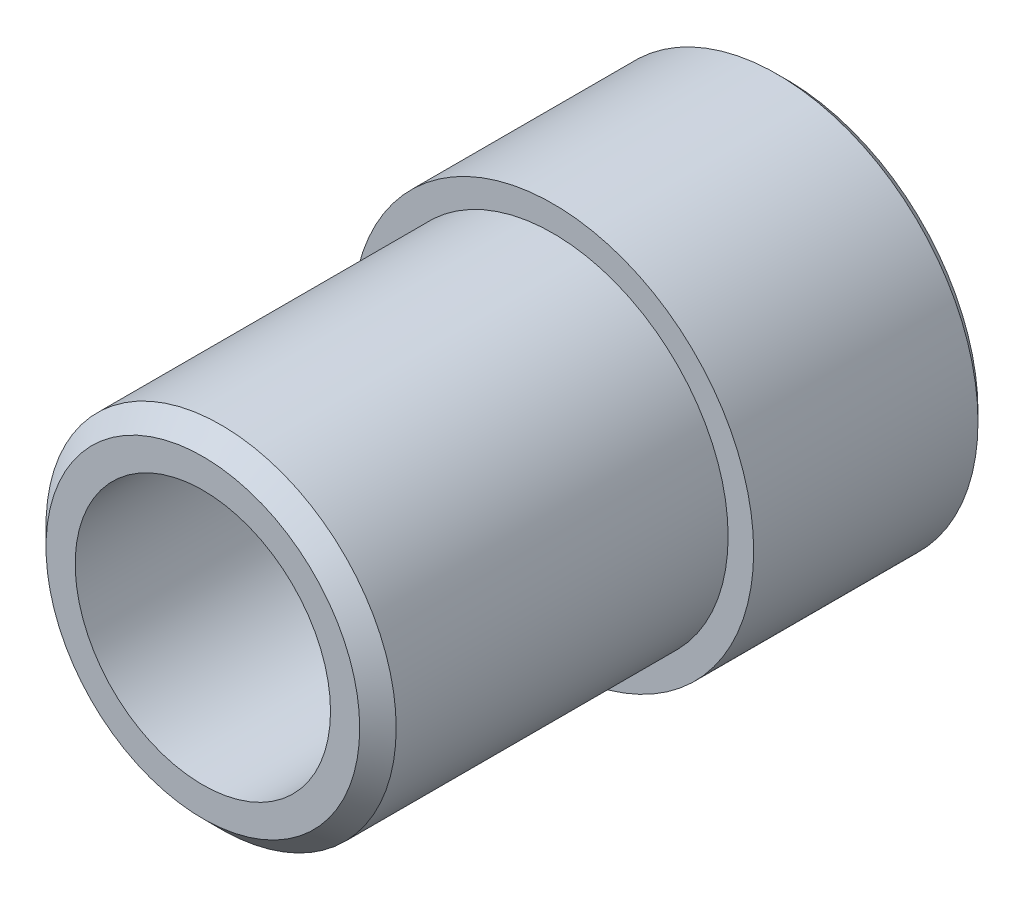
ISO-10303-21;
HEADER;
FILE_DESCRIPTION(('STEP AP214'),'2;1');
FILE_NAME('part.step','',(''),(''),'','','');
FILE_SCHEMA(('AUTOMOTIVE_DESIGN { 1 0 10303 214 1 1 1 1 }'));
ENDSEC;
DATA;
#1=APPLICATION_CONTEXT('core data for automotive mechanical design processes');
#2=APPLICATION_PROTOCOL_DEFINITION('international standard','automotive_design',2000,#1);
#3=PRODUCT_CONTEXT('',#1,'mechanical');
#4=PRODUCT('Part','Part','',(#3));
#5=PRODUCT_RELATED_PRODUCT_CATEGORY('part','',(#4));
#6=PRODUCT_DEFINITION_FORMATION('','',#4);
#7=PRODUCT_DEFINITION_CONTEXT('part definition',#1,'design');
#8=PRODUCT_DEFINITION('design','',#6,#7);
#9=PRODUCT_DEFINITION_SHAPE('','',#8);
#10=(LENGTH_UNIT() NAMED_UNIT(*) SI_UNIT(.MILLI.,.METRE.));
#11=(NAMED_UNIT(*) PLANE_ANGLE_UNIT() SI_UNIT($,.RADIAN.));
#12=(NAMED_UNIT(*) SI_UNIT($,.STERADIAN.) SOLID_ANGLE_UNIT());
#13=UNCERTAINTY_MEASURE_WITH_UNIT(LENGTH_MEASURE(1.E-05),#10,'distance_accuracy_value','');
#14=(GEOMETRIC_REPRESENTATION_CONTEXT(3) GLOBAL_UNCERTAINTY_ASSIGNED_CONTEXT((#13)) GLOBAL_UNIT_ASSIGNED_CONTEXT((#10,
#11,#12)) REPRESENTATION_CONTEXT('',''));
#15=CARTESIAN_POINT('',(0.,0.,0.));
#16=DIRECTION('',(0.,0.,1.));
#17=DIRECTION('',(1.,0.,0.));
#18=AXIS2_PLACEMENT_3D('',#15,#16,#17);
#19=CARTESIAN_POINT('',(0.,0.,0.));
#20=DIRECTION('',(0.,0.,1.));
#21=DIRECTION('',(1.,0.,0.));
#22=AXIS2_PLACEMENT_3D('',#19,#20,#21);
#23=PLANE('',#22);
#24=CARTESIAN_POINT('',(0.,0.,0.));
#25=DIRECTION('',(0.,0.,1.));
#26=DIRECTION('',(1.,0.,0.));
#27=AXIS2_PLACEMENT_3D('',#24,#25,#26);
#28=CIRCLE('',#27,10.5);
#29=CARTESIAN_POINT('',(10.5,0.,0.));
#30=VERTEX_POINT('',#29);
#31=EDGE_CURVE('E10',#30,#30,#28,.F.);
#32=ORIENTED_EDGE('',*,*,#31,.T.);
#33=EDGE_LOOP('',(#32));
#34=FACE_BOUND('',#33,.T.);
#35=CARTESIAN_POINT('',(0.,0.,0.));
#36=DIRECTION('',(0.,0.,1.));
#37=DIRECTION('',(1.,0.,0.));
#38=AXIS2_PLACEMENT_3D('',#35,#36,#37);
#39=CIRCLE('',#38,8.9);
#40=CARTESIAN_POINT('',(8.9,0.,0.));
#41=VERTEX_POINT('',#40);
#42=EDGE_CURVE('E60',#41,#41,#39,.T.);
#43=ORIENTED_EDGE('',*,*,#42,.T.);
#44=EDGE_LOOP('',(#43));
#45=FACE_BOUND('',#44,.T.);
#46=ADVANCED_FACE('F31',(#34,#45),#23,.F.);
#47=CARTESIAN_POINT('',(0.,0.,2.));
#48=DIRECTION('',(0.,0.,-1.));
#49=DIRECTION('',(-1.,0.,0.));
#50=AXIS2_PLACEMENT_3D('',#47,#48,#49);
#51=CYLINDRICAL_SURFACE('',#50,11.);
#52=CARTESIAN_POINT('',(0.,0.,0.499999999999997));
#53=DIRECTION('',(0.,0.,1.));
#54=DIRECTION('',(1.,0.,0.));
#55=AXIS2_PLACEMENT_3D('',#52,#53,#54);
#56=CIRCLE('',#55,11.);
#57=CARTESIAN_POINT('',(11.,0.,0.499999999999997));
#58=VERTEX_POINT('',#57);
#59=EDGE_CURVE('E38',#58,#58,#56,.T.);
#60=ORIENTED_EDGE('',*,*,#59,.T.);
#61=EDGE_LOOP('',(#60));
#62=FACE_BOUND('',#61,.T.);
#63=CARTESIAN_POINT('',(0.,0.,12.8));
#64=DIRECTION('',(0.,0.,1.));
#65=DIRECTION('',(1.,0.,0.));
#66=AXIS2_PLACEMENT_3D('',#63,#64,#65);
#67=CIRCLE('',#66,11.);
#68=CARTESIAN_POINT('',(11.,0.,12.8));
#69=VERTEX_POINT('',#68);
#70=EDGE_CURVE('E67',#69,#69,#67,.T.);
#71=ORIENTED_EDGE('',*,*,#70,.F.);
#72=EDGE_LOOP('',(#71));
#73=FACE_BOUND('',#72,.T.);
#74=ADVANCED_FACE('F96',(#62,#73),#51,.T.);
#75=CARTESIAN_POINT('',(0.,0.,2.));
#76=DIRECTION('',(0.,0.,-1.));
#77=DIRECTION('',(-1.,0.,0.));
#78=AXIS2_PLACEMENT_3D('',#75,#76,#77);
#79=CYLINDRICAL_SURFACE('',#78,8.4);
#80=CARTESIAN_POINT('',(0.,0.,1.69999999999999));
#81=DIRECTION('',(0.,0.,1.));
#82=DIRECTION('',(1.,0.,0.));
#83=AXIS2_PLACEMENT_3D('',#80,#81,#82);
#84=CIRCLE('',#83,8.4);
#85=CARTESIAN_POINT('',(-8.4,0.,1.69999999999999));
#86=VERTEX_POINT('',#85);
#87=EDGE_CURVE('E46',#86,#86,#84,.T.);
#88=ORIENTED_EDGE('',*,*,#87,.T.);
#89=EDGE_LOOP('',(#88));
#90=FACE_BOUND('',#89,.T.);
#91=CARTESIAN_POINT('',(0.,0.,0.500000000000002));
#92=DIRECTION('',(0.,0.,1.));
#93=DIRECTION('',(1.,0.,0.));
#94=AXIS2_PLACEMENT_3D('',#91,#92,#93);
#95=CIRCLE('',#94,8.4);
#96=CARTESIAN_POINT('',(8.4,0.,0.500000000000002));
#97=VERTEX_POINT('',#96);
#98=EDGE_CURVE('E57',#97,#97,#95,.F.);
#99=ORIENTED_EDGE('',*,*,#98,.T.);
#100=EDGE_LOOP('',(#99));
#101=FACE_BOUND('',#100,.T.);
#102=ADVANCED_FACE('F101',(#90,#101),#79,.F.);
#103=CARTESIAN_POINT('',(0.,0.,2.));
#104=DIRECTION('',(0.,0.,1.));
#105=DIRECTION('',(1.,0.,0.));
#106=AXIS2_PLACEMENT_3D('',#103,#104,#105);
#107=PLANE('',#106);
#108=CARTESIAN_POINT('',(0.,0.,2.));
#109=DIRECTION('',(0.,0.,1.));
#110=DIRECTION('',(1.,0.,0.));
#111=AXIS2_PLACEMENT_3D('',#108,#109,#110);
#112=CIRCLE('',#111,8.1);
#113=CARTESIAN_POINT('',(-8.1,0.,2.));
#114=VERTEX_POINT('',#113);
#115=EDGE_CURVE('E42',#114,#114,#112,.F.);
#116=ORIENTED_EDGE('',*,*,#115,.T.);
#117=EDGE_LOOP('',(#116));
#118=FACE_BOUND('',#117,.T.);
#119=CARTESIAN_POINT('',(0.,0.,2.));
#120=DIRECTION('',(0.,0.,1.));
#121=DIRECTION('',(1.,0.,0.));
#122=AXIS2_PLACEMENT_3D('',#119,#120,#121);
#123=CIRCLE('',#122,7.);
#124=CARTESIAN_POINT('',(7.,0.,2.));
#125=VERTEX_POINT('',#124);
#126=EDGE_CURVE('E64',#125,#125,#123,.T.);
#127=ORIENTED_EDGE('',*,*,#126,.T.);
#128=EDGE_LOOP('',(#127));
#129=FACE_BOUND('',#128,.T.);
#130=ADVANCED_FACE('F118',(#118,#129),#107,.F.);
#131=CARTESIAN_POINT('',(0.,0.,32.));
#132=DIRECTION('',(0.,0.,1.));
#133=DIRECTION('',(1.,0.,0.));
#134=AXIS2_PLACEMENT_3D('',#131,#132,#133);
#135=PLANE('',#134);
#136=CARTESIAN_POINT('',(0.,0.,32.));
#137=DIRECTION('',(0.,0.,1.));
#138=DIRECTION('',(1.,0.,0.));
#139=AXIS2_PLACEMENT_3D('',#136,#137,#138);
#140=CIRCLE('',#139,8.6);
#141=CARTESIAN_POINT('',(8.6,0.,32.));
#142=VERTEX_POINT('',#141);
#143=EDGE_CURVE('E54',#142,#142,#140,.T.);
#144=ORIENTED_EDGE('',*,*,#143,.T.);
#145=EDGE_LOOP('',(#144));
#146=FACE_BOUND('',#145,.T.);
#147=CARTESIAN_POINT('',(0.,0.,32.));
#148=DIRECTION('',(0.,0.,1.));
#149=DIRECTION('',(1.,0.,0.));
#150=AXIS2_PLACEMENT_3D('',#147,#148,#149);
#151=CIRCLE('',#150,7.);
#152=CARTESIAN_POINT('',(7.,0.,32.));
#153=VERTEX_POINT('',#152);
#154=EDGE_CURVE('E63',#153,#153,#151,.T.);
#155=ORIENTED_EDGE('',*,*,#154,.F.);
#156=EDGE_LOOP('',(#155));
#157=FACE_BOUND('',#156,.T.);
#158=ADVANCED_FACE('F125',(#146,#157),#135,.T.);
#159=CARTESIAN_POINT('',(0.,0.,32.));
#160=DIRECTION('',(0.,0.,-1.));
#161=DIRECTION('',(-1.,0.,0.));
#162=AXIS2_PLACEMENT_3D('',#159,#160,#161);
#163=CYLINDRICAL_SURFACE('',#162,9.6);
#164=CARTESIAN_POINT('',(0.,0.,31.));
#165=DIRECTION('',(0.,0.,1.));
#166=DIRECTION('',(1.,0.,0.));
#167=AXIS2_PLACEMENT_3D('',#164,#165,#166);
#168=CIRCLE('',#167,9.6);
#169=CARTESIAN_POINT('',(9.6,0.,31.));
#170=VERTEX_POINT('',#169);
#171=EDGE_CURVE('E51',#170,#170,#168,.F.);
#172=ORIENTED_EDGE('',*,*,#171,.T.);
#173=EDGE_LOOP('',(#172));
#174=FACE_BOUND('',#173,.T.);
#175=CARTESIAN_POINT('',(0.,0.,12.8));
#176=DIRECTION('',(0.,0.,1.));
#177=DIRECTION('',(1.,0.,0.));
#178=AXIS2_PLACEMENT_3D('',#175,#176,#177);
#179=CIRCLE('',#178,9.6);
#180=CARTESIAN_POINT('',(9.6,0.,12.8));
#181=VERTEX_POINT('',#180);
#182=EDGE_CURVE('E72',#181,#181,#179,.T.);
#183=ORIENTED_EDGE('',*,*,#182,.T.);
#184=EDGE_LOOP('',(#183));
#185=FACE_BOUND('',#184,.T.);
#186=ADVANCED_FACE('F76',(#174,#185),#163,.T.);
#187=CARTESIAN_POINT('',(0.,0.,32.));
#188=DIRECTION('',(0.,0.,-1.));
#189=DIRECTION('',(-1.,0.,0.));
#190=AXIS2_PLACEMENT_3D('',#187,#188,#189);
#191=CYLINDRICAL_SURFACE('',#190,7.);
#192=ORIENTED_EDGE('',*,*,#154,.T.);
#193=EDGE_LOOP('',(#192));
#194=FACE_BOUND('',#193,.T.);
#195=ORIENTED_EDGE('',*,*,#126,.F.);
#196=EDGE_LOOP('',(#195));
#197=FACE_BOUND('',#196,.T.);
#198=ADVANCED_FACE('F91',(#194,#197),#191,.F.);
#199=CARTESIAN_POINT('',(0.,0.,0.));
#200=DIRECTION('',(0.,0.,-1.));
#201=DIRECTION('',(-1.,0.,0.));
#202=AXIS2_PLACEMENT_3D('',#199,#200,#201);
#203=CONICAL_SURFACE('',#202,8.9,0.785398163397447);
#204=ORIENTED_EDGE('',*,*,#98,.F.);
#205=EDGE_LOOP('',(#204));
#206=FACE_BOUND('',#205,.T.);
#207=ORIENTED_EDGE('',*,*,#42,.F.);
#208=EDGE_LOOP('',(#207));
#209=FACE_BOUND('',#208,.T.);
#210=ADVANCED_FACE('F81',(#206,#209),#203,.F.);
#211=CARTESIAN_POINT('',(0.,0.,12.8));
#212=DIRECTION('',(0.,0.,1.));
#213=DIRECTION('',(1.,0.,0.));
#214=AXIS2_PLACEMENT_3D('',#211,#212,#213);
#215=PLANE('',#214);
#216=ORIENTED_EDGE('',*,*,#70,.T.);
#217=EDGE_LOOP('',(#216));
#218=FACE_BOUND('',#217,.T.);
#219=ORIENTED_EDGE('',*,*,#182,.F.);
#220=EDGE_LOOP('',(#219));
#221=FACE_BOUND('',#220,.T.);
#222=ADVANCED_FACE('F78',(#218,#221),#215,.T.);
#223=CARTESIAN_POINT('',(0.,0.,32.));
#224=DIRECTION('',(0.,0.,-1.));
#225=DIRECTION('',(-1.,0.,0.));
#226=AXIS2_PLACEMENT_3D('',#223,#224,#225);
#227=CONICAL_SURFACE('',#226,8.6,0.785398163397446);
#228=ORIENTED_EDGE('',*,*,#171,.F.);
#229=EDGE_LOOP('',(#228));
#230=FACE_BOUND('',#229,.T.);
#231=ORIENTED_EDGE('',*,*,#143,.F.);
#232=EDGE_LOOP('',(#231));
#233=FACE_BOUND('',#232,.T.);
#234=ADVANCED_FACE('F80',(#230,#233),#227,.T.);
#235=CARTESIAN_POINT('',(0.,0.,1.69999999999999));
#236=DIRECTION('',(0.,0.,-1.));
#237=DIRECTION('',(-1.,0.,0.));
#238=AXIS2_PLACEMENT_3D('',#235,#236,#237);
#239=CONICAL_SURFACE('',#238,8.4,0.785398163397443);
#240=CARTESIAN_POINT('',(-8.1,0.,2.));
#241=CARTESIAN_POINT('',(-8.103125,0.,1.996875));
#242=CARTESIAN_POINT('',(-8.10625,0.,1.99375));
#243=CARTESIAN_POINT('',(-8.1125,0.,1.9875));
#244=CARTESIAN_POINT('',(-8.115625,0.,1.984375));
#245=CARTESIAN_POINT('',(-8.121875,0.,1.978125));
#246=CARTESIAN_POINT('',(-8.125,0.,1.975));
#247=CARTESIAN_POINT('',(-8.13125,0.,1.96875));
#248=CARTESIAN_POINT('',(-8.134375,0.,1.965625));
#249=CARTESIAN_POINT('',(-8.140625,0.,1.959375));
#250=CARTESIAN_POINT('',(-8.14375,0.,1.95625));
#251=CARTESIAN_POINT('',(-8.15,0.,1.95));
#252=CARTESIAN_POINT('',(-8.153125,0.,1.946875));
#253=CARTESIAN_POINT('',(-8.159375,0.,1.940625));
#254=CARTESIAN_POINT('',(-8.1625,0.,1.9375));
#255=CARTESIAN_POINT('',(-8.16875,0.,1.93125));
#256=CARTESIAN_POINT('',(-8.171875,0.,1.928125));
#257=CARTESIAN_POINT('',(-8.178125,0.,1.921875));
#258=CARTESIAN_POINT('',(-8.18125,0.,1.91875));
#259=CARTESIAN_POINT('',(-8.1875,0.,1.9125));
#260=CARTESIAN_POINT('',(-8.190625,0.,1.909375));
#261=CARTESIAN_POINT('',(-8.196875,0.,1.903125));
#262=CARTESIAN_POINT('',(-8.2,0.,1.9));
#263=CARTESIAN_POINT('',(-8.20625,0.,1.89375));
#264=CARTESIAN_POINT('',(-8.209375,0.,1.890625));
#265=CARTESIAN_POINT('',(-8.215625,0.,1.884375));
#266=CARTESIAN_POINT('',(-8.21875,0.,1.88125));
#267=CARTESIAN_POINT('',(-8.225,0.,1.875));
#268=CARTESIAN_POINT('',(-8.228125,0.,1.871875));
#269=CARTESIAN_POINT('',(-8.234375,0.,1.865625));
#270=CARTESIAN_POINT('',(-8.2375,0.,1.8625));
#271=CARTESIAN_POINT('',(-8.24375,0.,1.85625));
#272=CARTESIAN_POINT('',(-8.246875,0.,1.853125));
#273=CARTESIAN_POINT('',(-8.253125,0.,1.846875));
#274=CARTESIAN_POINT('',(-8.25625,0.,1.84375));
#275=CARTESIAN_POINT('',(-8.2625,0.,1.8375));
#276=CARTESIAN_POINT('',(-8.265625,0.,1.834375));
#277=CARTESIAN_POINT('',(-8.271875,0.,1.828125));
#278=CARTESIAN_POINT('',(-8.275,0.,1.825));
#279=CARTESIAN_POINT('',(-8.28125,0.,1.81875));
#280=CARTESIAN_POINT('',(-8.284375,0.,1.815625));
#281=CARTESIAN_POINT('',(-8.290625,0.,1.809375));
#282=CARTESIAN_POINT('',(-8.29375,0.,1.80625));
#283=CARTESIAN_POINT('',(-8.3,0.,1.8));
#284=CARTESIAN_POINT('',(-8.303125,0.,1.796875));
#285=CARTESIAN_POINT('',(-8.309375,0.,1.790625));
#286=CARTESIAN_POINT('',(-8.3125,0.,1.7875));
#287=CARTESIAN_POINT('',(-8.31875,0.,1.78125));
#288=CARTESIAN_POINT('',(-8.321875,0.,1.778125));
#289=CARTESIAN_POINT('',(-8.328125,0.,1.771875));
#290=CARTESIAN_POINT('',(-8.33125,0.,1.76875));
#291=CARTESIAN_POINT('',(-8.3375,0.,1.7625));
#292=CARTESIAN_POINT('',(-8.340625,0.,1.759375));
#293=CARTESIAN_POINT('',(-8.346875,0.,1.753125));
#294=CARTESIAN_POINT('',(-8.35,0.,1.75));
#295=CARTESIAN_POINT('',(-8.35625,0.,1.74375));
#296=CARTESIAN_POINT('',(-8.359375,0.,1.740625));
#297=CARTESIAN_POINT('',(-8.365625,0.,1.734375));
#298=CARTESIAN_POINT('',(-8.36875,0.,1.73125));
#299=CARTESIAN_POINT('',(-8.375,0.,1.72499999999999));
#300=CARTESIAN_POINT('',(-8.378125,0.,1.721875));
#301=CARTESIAN_POINT('',(-8.384375,0.,1.715625));
#302=CARTESIAN_POINT('',(-8.3875,0.,1.7125));
#303=CARTESIAN_POINT('',(-8.39375,0.,1.70624999999999));
#304=CARTESIAN_POINT('',(-8.396875,0.,1.70312499999999));
#305=CARTESIAN_POINT('',(-8.4,0.,1.69999999999999));
#306=B_SPLINE_CURVE_WITH_KNOTS('',3,(#240,#241,#242,#243,#244,#245,#246,#247,#248,#249,#250,
#251,#252,#253,#254,#255,#256,#257,#258,#259,#260,#261,#262,#263,#264,#265,#266,#267,#268,#269,
#270,#271,#272,#273,#274,#275,#276,#277,#278,#279,#280,#281,#282,#283,#284,#285,#286,#287,#288,
#289,#290,#291,#292,#293,#294,#295,#296,#297,#298,#299,#300,#301,#302,#303,#304,#305),
.UNSPECIFIED.,.F.,.F.,(4,2,2,2,2,2,2,2,2,2,2,2,2,2,2,2,2,2,2,2,2,2,2,2,2,2,2,2,2,2,2,2,4),(0.,
0.0132582521472481,0.0265165042944954,0.0397747564417438,0.0530330085889923,0.0662912607362394,
0.0795495128834876,0.0928077650307349,0.106066017177983,0.119324269325231,0.132582521472479,
0.145840773619727,0.159099025766975,0.172357277914223,0.185615530061471,0.198873782208718,
0.212132034355967,0.225390286503215,0.238648538650462,0.25190679079771,0.265165042944959,
0.278423295092206,0.291681547239454,0.304939799386701,0.31819805153395,0.331456303681198,
0.344714555828445,0.357972807975694,0.371231060122942,0.384489312270189,0.397747564417438,
0.411005816564685,0.424264068711933),.UNSPECIFIED.);
#307=EDGE_CURVE('BSEAM88',#114,#86,#306,.T.);
#308=ORIENTED_EDGE('',*,*,#115,.F.);
#309=ORIENTED_EDGE('',*,*,#87,.F.);
#310=ORIENTED_EDGE('',*,*,#307,.T.);
#311=ORIENTED_EDGE('',*,*,#307,.F.);
#312=EDGE_LOOP('',(#308,#310,#309,#311));
#313=FACE_BOUND('',#312,.T.);
#314=ADVANCED_FACE('F88',(#313),#239,.F.);
#315=CARTESIAN_POINT('',(0.,0.,0.499999999999997));
#316=DIRECTION('',(0.,0.,1.));
#317=DIRECTION('',(1.,0.,0.));
#318=AXIS2_PLACEMENT_3D('',#315,#316,#317);
#319=CONICAL_SURFACE('',#318,11.,0.785398163397455);
#320=ORIENTED_EDGE('',*,*,#31,.F.);
#321=EDGE_LOOP('',(#320));
#322=FACE_BOUND('',#321,.T.);
#323=ORIENTED_EDGE('',*,*,#59,.F.);
#324=EDGE_LOOP('',(#323));
#325=FACE_BOUND('',#324,.T.);
#326=ADVANCED_FACE('F33',(#322,#325),#319,.T.);
#327=CLOSED_SHELL('',(#46,#74,#102,#130,#158,#186,#198,#210,#222,#234,#314,#326));
#328=MANIFOLD_SOLID_BREP('B2',#327);
#329=ADVANCED_BREP_SHAPE_REPRESENTATION('',(#18,#328),#14);
#330=SHAPE_DEFINITION_REPRESENTATION(#9,#329);
ENDSEC;
END-ISO-10303-21;
